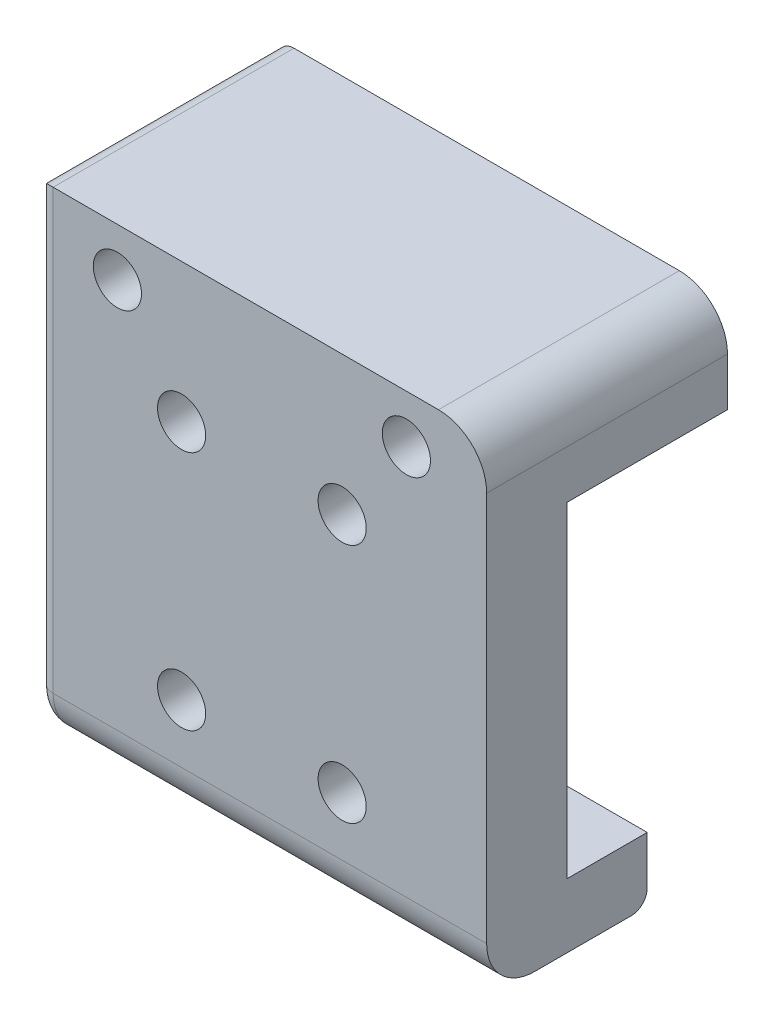
ISO-10303-21;
HEADER;
FILE_DESCRIPTION(('STEP AP214'),'2;1');
FILE_NAME('part.step','',(''),(''),'','','');
FILE_SCHEMA(('AUTOMOTIVE_DESIGN { 1 0 10303 214 1 1 1 1 }'));
ENDSEC;
DATA;
#1=APPLICATION_CONTEXT('core data for automotive mechanical design processes');
#2=APPLICATION_PROTOCOL_DEFINITION('international standard','automotive_design',2000,#1);
#3=PRODUCT_CONTEXT('',#1,'mechanical');
#4=PRODUCT('Part','Part','',(#3));
#5=PRODUCT_RELATED_PRODUCT_CATEGORY('part','',(#4));
#6=PRODUCT_DEFINITION_FORMATION('','',#4);
#7=PRODUCT_DEFINITION_CONTEXT('part definition',#1,'design');
#8=PRODUCT_DEFINITION('design','',#6,#7);
#9=PRODUCT_DEFINITION_SHAPE('','',#8);
#10=(LENGTH_UNIT() NAMED_UNIT(*) SI_UNIT(.MILLI.,.METRE.));
#11=(NAMED_UNIT(*) PLANE_ANGLE_UNIT() SI_UNIT($,.RADIAN.));
#12=(NAMED_UNIT(*) SI_UNIT($,.STERADIAN.) SOLID_ANGLE_UNIT());
#13=UNCERTAINTY_MEASURE_WITH_UNIT(LENGTH_MEASURE(1.E-05),#10,'distance_accuracy_value','');
#14=(GEOMETRIC_REPRESENTATION_CONTEXT(3) GLOBAL_UNCERTAINTY_ASSIGNED_CONTEXT((#13)) GLOBAL_UNIT_ASSIGNED_CONTEXT((#10,
#11,#12)) REPRESENTATION_CONTEXT('',''));
#15=CARTESIAN_POINT('',(0.,0.,0.));
#16=DIRECTION('',(0.,0.,1.));
#17=DIRECTION('',(1.,0.,0.));
#18=AXIS2_PLACEMENT_3D('',#15,#16,#17);
#19=CARTESIAN_POINT('',(0.,0.,5.));
#20=DIRECTION('',(0.,0.,1.));
#21=DIRECTION('',(1.,0.,0.));
#22=AXIS2_PLACEMENT_3D('',#19,#20,#21);
#23=PLANE('',#22);
#24=CARTESIAN_POINT('',(-9.,13.15,5.));
#25=DIRECTION('',(0.,0.,1.));
#26=DIRECTION('',(1.,0.,0.));
#27=AXIS2_PLACEMENT_3D('',#24,#25,#26);
#28=CIRCLE('',#27,1.5);
#29=CARTESIAN_POINT('',(-7.5,13.15,5.));
#30=VERTEX_POINT('',#29);
#31=EDGE_CURVE('E284',#30,#30,#28,.T.);
#32=ORIENTED_EDGE('',*,*,#31,.F.);
#33=EDGE_LOOP('',(#32));
#34=FACE_BOUND('',#33,.T.);
#35=CARTESIAN_POINT('',(9.,13.15,5.));
#36=DIRECTION('',(0.,0.,1.));
#37=DIRECTION('',(1.,0.,0.));
#38=AXIS2_PLACEMENT_3D('',#35,#36,#37);
#39=CIRCLE('',#38,1.5);
#40=CARTESIAN_POINT('',(10.5,13.15,5.));
#41=VERTEX_POINT('',#40);
#42=EDGE_CURVE('E281',#41,#41,#39,.T.);
#43=ORIENTED_EDGE('',*,*,#42,.F.);
#44=EDGE_LOOP('',(#43));
#45=FACE_BOUND('',#44,.T.);
#46=CARTESIAN_POINT('',(5.00000000000001,-7.5,5.));
#47=DIRECTION('',(0.,0.,1.));
#48=DIRECTION('',(1.,0.,0.));
#49=AXIS2_PLACEMENT_3D('',#46,#47,#48);
#50=CIRCLE('',#49,1.5);
#51=CARTESIAN_POINT('',(6.50000000000001,-7.5,5.));
#52=VERTEX_POINT('',#51);
#53=EDGE_CURVE('E197',#52,#52,#50,.T.);
#54=ORIENTED_EDGE('',*,*,#53,.F.);
#55=EDGE_LOOP('',(#54));
#56=FACE_BOUND('',#55,.T.);
#57=CARTESIAN_POINT('',(-5.,7.5,5.));
#58=DIRECTION('',(0.,0.,1.));
#59=DIRECTION('',(1.,0.,0.));
#60=AXIS2_PLACEMENT_3D('',#57,#58,#59);
#61=CIRCLE('',#60,1.5);
#62=CARTESIAN_POINT('',(-3.5,7.5,5.));
#63=VERTEX_POINT('',#62);
#64=EDGE_CURVE('E209',#63,#63,#61,.T.);
#65=ORIENTED_EDGE('',*,*,#64,.F.);
#66=EDGE_LOOP('',(#65));
#67=FACE_BOUND('',#66,.T.);
#68=DIRECTION('',(-1.,0.,0.));
#69=VECTOR('',#68,1.);
#70=CARTESIAN_POINT('',(0.,16.15,5.));
#71=LINE('',#70,#69);
#72=CARTESIAN_POINT('',(11.,16.15,5.));
#73=VERTEX_POINT('',#72);
#74=CARTESIAN_POINT('',(-13.,16.15,5.));
#75=VERTEX_POINT('',#74);
#76=EDGE_CURVE('E183',#73,#75,#71,.T.);
#77=ORIENTED_EDGE('',*,*,#76,.T.);
#78=DIRECTION('',(0.,-1.,0.));
#79=VECTOR('',#78,1.);
#80=CARTESIAN_POINT('',(-13.,-11.15,5.));
#81=LINE('',#80,#79);
#82=CARTESIAN_POINT('',(-13.,-11.15,5.));
#83=VERTEX_POINT('',#82);
#84=EDGE_CURVE('E240',#75,#83,#81,.T.);
#85=ORIENTED_EDGE('',*,*,#84,.T.);
#86=DIRECTION('',(1.,0.,0.));
#87=VECTOR('',#86,1.);
#88=CARTESIAN_POINT('',(0.,-11.15,5.));
#89=LINE('',#88,#87);
#90=CARTESIAN_POINT('',(14.,-11.15,5.));
#91=VERTEX_POINT('',#90);
#92=EDGE_CURVE('E230',#83,#91,#89,.T.);
#93=ORIENTED_EDGE('',*,*,#92,.T.);
#94=DIRECTION('',(0.,1.,0.));
#95=VECTOR('',#94,1.);
#96=CARTESIAN_POINT('',(14.,10.15,5.));
#97=LINE('',#96,#95);
#98=CARTESIAN_POINT('',(14.,13.15,5.));
#99=VERTEX_POINT('',#98);
#100=EDGE_CURVE('E214',#91,#99,#97,.T.);
#101=ORIENTED_EDGE('',*,*,#100,.T.);
#102=CARTESIAN_POINT('',(11.,13.15,5.));
#103=DIRECTION('',(0.,0.,1.));
#104=DIRECTION('',(1.,0.,0.));
#105=AXIS2_PLACEMENT_3D('',#102,#103,#104);
#106=CIRCLE('',#105,3.);
#107=EDGE_CURVE('E232',#99,#73,#106,.T.);
#108=ORIENTED_EDGE('',*,*,#107,.T.);
#109=EDGE_LOOP('',(#77,#85,#93,#101,#108));
#110=FACE_BOUND('',#109,.T.);
#111=CARTESIAN_POINT('',(5.,7.5,5.));
#112=DIRECTION('',(0.,0.,1.));
#113=DIRECTION('',(1.,0.,0.));
#114=AXIS2_PLACEMENT_3D('',#111,#112,#113);
#115=CIRCLE('',#114,1.5);
#116=CARTESIAN_POINT('',(6.5,7.5,5.));
#117=VERTEX_POINT('',#116);
#118=EDGE_CURVE('E203',#117,#117,#115,.T.);
#119=ORIENTED_EDGE('',*,*,#118,.F.);
#120=EDGE_LOOP('',(#119));
#121=FACE_BOUND('',#120,.T.);
#122=CARTESIAN_POINT('',(-5.,-7.5,5.));
#123=DIRECTION('',(0.,0.,1.));
#124=DIRECTION('',(1.,0.,0.));
#125=AXIS2_PLACEMENT_3D('',#122,#123,#124);
#126=CIRCLE('',#125,1.5);
#127=CARTESIAN_POINT('',(-3.5,-7.5,5.));
#128=VERTEX_POINT('',#127);
#129=EDGE_CURVE('E191',#128,#128,#126,.T.);
#130=ORIENTED_EDGE('',*,*,#129,.F.);
#131=EDGE_LOOP('',(#130));
#132=FACE_BOUND('',#131,.T.);
#133=ADVANCED_FACE('F44',(#34,#45,#56,#67,#110,#121,#132),#23,.T.);
#134=CARTESIAN_POINT('',(0.,0.,0.));
#135=DIRECTION('',(0.,0.,1.));
#136=DIRECTION('',(1.,0.,0.));
#137=AXIS2_PLACEMENT_3D('',#134,#135,#136);
#138=PLANE('',#137);
#139=DIRECTION('',(0.,1.,0.));
#140=VECTOR('',#139,1.);
#141=CARTESIAN_POINT('',(14.,10.15,0.));
#142=LINE('',#141,#140);
#143=CARTESIAN_POINT('',(14.,-10.15,0.));
#144=VERTEX_POINT('',#143);
#145=CARTESIAN_POINT('',(14.,10.15,0.));
#146=VERTEX_POINT('',#145);
#147=EDGE_CURVE('E160',#144,#146,#142,.T.);
#148=ORIENTED_EDGE('',*,*,#147,.F.);
#149=DIRECTION('',(1.,0.,0.));
#150=VECTOR('',#149,1.);
#151=CARTESIAN_POINT('',(-14.,-10.15,0.));
#152=LINE('',#151,#150);
#153=CARTESIAN_POINT('',(-14.,-10.15,0.));
#154=VERTEX_POINT('',#153);
#155=EDGE_CURVE('E218',#154,#144,#152,.T.);
#156=ORIENTED_EDGE('',*,*,#155,.F.);
#157=DIRECTION('',(0.,-1.,0.));
#158=VECTOR('',#157,1.);
#159=CARTESIAN_POINT('',(-14.,10.15,0.));
#160=LINE('',#159,#158);
#161=CARTESIAN_POINT('',(-14.,10.15,0.));
#162=VERTEX_POINT('',#161);
#163=EDGE_CURVE('E222',#162,#154,#160,.T.);
#164=ORIENTED_EDGE('',*,*,#163,.F.);
#165=DIRECTION('',(-1.,0.,0.));
#166=VECTOR('',#165,1.);
#167=CARTESIAN_POINT('',(-14.,10.15,0.));
#168=LINE('',#167,#166);
#169=EDGE_CURVE('E220',#146,#162,#168,.T.);
#170=ORIENTED_EDGE('',*,*,#169,.F.);
#171=EDGE_LOOP('',(#148,#156,#164,#170));
#172=FACE_BOUND('',#171,.T.);
#173=CARTESIAN_POINT('',(-5.,7.5,0.));
#174=DIRECTION('',(0.,0.,1.));
#175=DIRECTION('',(1.,0.,0.));
#176=AXIS2_PLACEMENT_3D('',#173,#174,#175);
#177=CIRCLE('',#176,1.5);
#178=CARTESIAN_POINT('',(-3.5,7.5,0.));
#179=VERTEX_POINT('',#178);
#180=EDGE_CURVE('E206',#179,#179,#177,.T.);
#181=ORIENTED_EDGE('',*,*,#180,.T.);
#182=EDGE_LOOP('',(#181));
#183=FACE_BOUND('',#182,.T.);
#184=CARTESIAN_POINT('',(5.,7.5,0.));
#185=DIRECTION('',(0.,0.,1.));
#186=DIRECTION('',(1.,0.,0.));
#187=AXIS2_PLACEMENT_3D('',#184,#185,#186);
#188=CIRCLE('',#187,1.5);
#189=CARTESIAN_POINT('',(6.5,7.5,0.));
#190=VERTEX_POINT('',#189);
#191=EDGE_CURVE('E200',#190,#190,#188,.T.);
#192=ORIENTED_EDGE('',*,*,#191,.T.);
#193=EDGE_LOOP('',(#192));
#194=FACE_BOUND('',#193,.T.);
#195=CARTESIAN_POINT('',(5.00000000000001,-7.5,0.));
#196=DIRECTION('',(0.,0.,1.));
#197=DIRECTION('',(1.,0.,0.));
#198=AXIS2_PLACEMENT_3D('',#195,#196,#197);
#199=CIRCLE('',#198,1.5);
#200=CARTESIAN_POINT('',(6.50000000000001,-7.5,0.));
#201=VERTEX_POINT('',#200);
#202=EDGE_CURVE('E194',#201,#201,#199,.T.);
#203=ORIENTED_EDGE('',*,*,#202,.T.);
#204=EDGE_LOOP('',(#203));
#205=FACE_BOUND('',#204,.T.);
#206=CARTESIAN_POINT('',(-5.,-7.5,0.));
#207=DIRECTION('',(0.,0.,1.));
#208=DIRECTION('',(1.,0.,0.));
#209=AXIS2_PLACEMENT_3D('',#206,#207,#208);
#210=CIRCLE('',#209,1.5);
#211=CARTESIAN_POINT('',(-3.5,-7.5,0.));
#212=VERTEX_POINT('',#211);
#213=EDGE_CURVE('E163',#212,#212,#210,.T.);
#214=ORIENTED_EDGE('',*,*,#213,.T.);
#215=EDGE_LOOP('',(#214));
#216=FACE_BOUND('',#215,.T.);
#217=ADVANCED_FACE('F301',(#172,#183,#194,#205,#216),#138,.F.);
#218=CARTESIAN_POINT('',(14.,10.15,5.));
#219=DIRECTION('',(-1.,0.,0.));
#220=DIRECTION('',(0.,-1.,0.));
#221=AXIS2_PLACEMENT_3D('',#218,#219,#220);
#222=PLANE('',#221);
#223=DIRECTION('',(0.,0.,1.));
#224=VECTOR('',#223,1.);
#225=CARTESIAN_POINT('',(14.,-14.15,-5.));
#226=LINE('',#225,#224);
#227=CARTESIAN_POINT('',(14.,-14.15,-4.));
#228=VERTEX_POINT('',#227);
#229=CARTESIAN_POINT('',(14.,-14.15,2.));
#230=VERTEX_POINT('',#229);
#231=EDGE_CURVE('E181',#228,#230,#226,.T.);
#232=ORIENTED_EDGE('',*,*,#231,.F.);
#233=CARTESIAN_POINT('',(14.,-13.15,-4.));
#234=DIRECTION('',(-1.,0.,0.));
#235=DIRECTION('',(0.,-1.,0.));
#236=AXIS2_PLACEMENT_3D('',#233,#234,#235);
#237=CIRCLE('',#236,1.);
#238=CARTESIAN_POINT('',(14.,-13.15,-5.));
#239=VERTEX_POINT('',#238);
#240=EDGE_CURVE('E53',#228,#239,#237,.F.);
#241=ORIENTED_EDGE('',*,*,#240,.T.);
#242=DIRECTION('',(0.,-1.,0.));
#243=VECTOR('',#242,1.);
#244=CARTESIAN_POINT('',(14.,0.,-5.));
#245=LINE('',#244,#243);
#246=CARTESIAN_POINT('',(14.,-10.15,-5.));
#247=VERTEX_POINT('',#246);
#248=EDGE_CURVE('E170',#247,#239,#245,.T.);
#249=ORIENTED_EDGE('',*,*,#248,.F.);
#250=DIRECTION('',(0.,0.,1.));
#251=VECTOR('',#250,1.);
#252=CARTESIAN_POINT('',(14.,-10.15,-5.));
#253=LINE('',#252,#251);
#254=EDGE_CURVE('E180',#247,#144,#253,.T.);
#255=ORIENTED_EDGE('',*,*,#254,.T.);
#256=ORIENTED_EDGE('',*,*,#147,.T.);
#257=DIRECTION('',(0.,0.,1.));
#258=VECTOR('',#257,1.);
#259=CARTESIAN_POINT('',(14.,10.15,-5.));
#260=LINE('',#259,#258);
#261=CARTESIAN_POINT('',(14.,10.15,-10.));
#262=VERTEX_POINT('',#261);
#263=EDGE_CURVE('E157',#262,#146,#260,.T.);
#264=ORIENTED_EDGE('',*,*,#263,.F.);
#265=DIRECTION('',(0.,-1.,0.));
#266=VECTOR('',#265,1.);
#267=CARTESIAN_POINT('',(14.,16.15,-10.));
#268=LINE('',#267,#266);
#269=CARTESIAN_POINT('',(14.,13.15,-10.));
#270=VERTEX_POINT('',#269);
#271=EDGE_CURVE('E142',#270,#262,#268,.T.);
#272=ORIENTED_EDGE('',*,*,#271,.F.);
#273=DIRECTION('',(0.,0.,1.));
#274=VECTOR('',#273,1.);
#275=CARTESIAN_POINT('',(14.,13.15,5.));
#276=LINE('',#275,#274);
#277=EDGE_CURVE('E228',#270,#99,#276,.T.);
#278=ORIENTED_EDGE('',*,*,#277,.T.);
#279=ORIENTED_EDGE('',*,*,#100,.F.);
#280=CARTESIAN_POINT('',(14.,-11.15,2.));
#281=DIRECTION('',(-1.,0.,0.));
#282=DIRECTION('',(0.,-1.,0.));
#283=AXIS2_PLACEMENT_3D('',#280,#281,#282);
#284=CIRCLE('',#283,3.);
#285=EDGE_CURVE('E217',#91,#230,#284,.F.);
#286=ORIENTED_EDGE('',*,*,#285,.T.);
#287=EDGE_LOOP('',(#232,#241,#249,#255,#256,#264,#272,#278,#279,#286));
#288=FACE_BOUND('',#287,.T.);
#289=ADVANCED_FACE('F158',(#288),#222,.F.);
#290=CARTESIAN_POINT('',(-14.,10.15,5.));
#291=DIRECTION('',(1.,0.,0.));
#292=DIRECTION('',(0.,1.,0.));
#293=AXIS2_PLACEMENT_3D('',#290,#291,#292);
#294=PLANE('',#293);
#295=DIRECTION('',(0.,-1.,0.));
#296=VECTOR('',#295,1.);
#297=CARTESIAN_POINT('',(-14.,16.15,4.));
#298=LINE('',#297,#296);
#299=CARTESIAN_POINT('',(-14.,-11.15,4.));
#300=VERTEX_POINT('',#299);
#301=CARTESIAN_POINT('',(-14.,15.15,4.));
#302=VERTEX_POINT('',#301);
#303=EDGE_CURVE('E247',#300,#302,#298,.F.);
#304=ORIENTED_EDGE('',*,*,#303,.T.);
#305=DIRECTION('',(0.,0.,1.));
#306=VECTOR('',#305,1.);
#307=CARTESIAN_POINT('',(-14.,15.15,-10.));
#308=LINE('',#307,#306);
#309=CARTESIAN_POINT('',(-14.,15.15,-10.));
#310=VERTEX_POINT('',#309);
#311=EDGE_CURVE('E249',#302,#310,#308,.F.);
#312=ORIENTED_EDGE('',*,*,#311,.T.);
#313=DIRECTION('',(0.,1.,0.));
#314=VECTOR('',#313,1.);
#315=CARTESIAN_POINT('',(-14.,10.15,-10.));
#316=LINE('',#315,#314);
#317=CARTESIAN_POINT('',(-14.,10.15,-10.));
#318=VERTEX_POINT('',#317);
#319=EDGE_CURVE('E168',#318,#310,#316,.T.);
#320=ORIENTED_EDGE('',*,*,#319,.F.);
#321=DIRECTION('',(0.,0.,1.));
#322=VECTOR('',#321,1.);
#323=CARTESIAN_POINT('',(-14.,10.15,-5.));
#324=LINE('',#323,#322);
#325=EDGE_CURVE('E164',#318,#162,#324,.T.);
#326=ORIENTED_EDGE('',*,*,#325,.T.);
#327=ORIENTED_EDGE('',*,*,#163,.T.);
#328=DIRECTION('',(0.,0.,1.));
#329=VECTOR('',#328,1.);
#330=CARTESIAN_POINT('',(-14.,-10.15,-5.));
#331=LINE('',#330,#329);
#332=CARTESIAN_POINT('',(-14.,-10.15,-5.));
#333=VERTEX_POINT('',#332);
#334=EDGE_CURVE('E184',#333,#154,#331,.T.);
#335=ORIENTED_EDGE('',*,*,#334,.F.);
#336=DIRECTION('',(0.,-1.,0.));
#337=VECTOR('',#336,1.);
#338=CARTESIAN_POINT('',(-14.,0.,-5.));
#339=LINE('',#338,#337);
#340=CARTESIAN_POINT('',(-14.,-13.15,-5.));
#341=VERTEX_POINT('',#340);
#342=EDGE_CURVE('E177',#333,#341,#339,.T.);
#343=ORIENTED_EDGE('',*,*,#342,.T.);
#344=DIRECTION('',(0.,0.,1.));
#345=VECTOR('',#344,1.);
#346=CARTESIAN_POINT('',(-14.,-13.15,2.));
#347=LINE('',#346,#345);
#348=CARTESIAN_POINT('',(-14.,-13.15,2.));
#349=VERTEX_POINT('',#348);
#350=EDGE_CURVE('E243',#341,#349,#347,.T.);
#351=ORIENTED_EDGE('',*,*,#350,.T.);
#352=CARTESIAN_POINT('',(-14.,-11.15,2.));
#353=DIRECTION('',(1.,0.,0.));
#354=DIRECTION('',(0.,1.,0.));
#355=AXIS2_PLACEMENT_3D('',#352,#353,#354);
#356=CIRCLE('',#355,2.);
#357=EDGE_CURVE('E245',#349,#300,#356,.F.);
#358=ORIENTED_EDGE('',*,*,#357,.T.);
#359=EDGE_LOOP('',(#304,#312,#320,#326,#327,#335,#343,#351,#358));
#360=FACE_BOUND('',#359,.T.);
#361=ADVANCED_FACE('F329',(#360),#294,.F.);
#362=CARTESIAN_POINT('',(-5.,7.5,5.));
#363=DIRECTION('',(0.,0.,-1.));
#364=DIRECTION('',(-1.,0.,0.));
#365=AXIS2_PLACEMENT_3D('',#362,#363,#364);
#366=CYLINDRICAL_SURFACE('',#365,1.5);
#367=ORIENTED_EDGE('',*,*,#64,.T.);
#368=EDGE_LOOP('',(#367));
#369=FACE_BOUND('',#368,.T.);
#370=ORIENTED_EDGE('',*,*,#180,.F.);
#371=EDGE_LOOP('',(#370));
#372=FACE_BOUND('',#371,.T.);
#373=ADVANCED_FACE('F335',(#369,#372),#366,.F.);
#374=CARTESIAN_POINT('',(5.,7.5,5.));
#375=DIRECTION('',(0.,0.,-1.));
#376=DIRECTION('',(-1.,0.,0.));
#377=AXIS2_PLACEMENT_3D('',#374,#375,#376);
#378=CYLINDRICAL_SURFACE('',#377,1.5);
#379=ORIENTED_EDGE('',*,*,#118,.T.);
#380=EDGE_LOOP('',(#379));
#381=FACE_BOUND('',#380,.T.);
#382=ORIENTED_EDGE('',*,*,#191,.F.);
#383=EDGE_LOOP('',(#382));
#384=FACE_BOUND('',#383,.T.);
#385=ADVANCED_FACE('F403',(#381,#384),#378,.F.);
#386=CARTESIAN_POINT('',(5.00000000000001,-7.5,5.));
#387=DIRECTION('',(0.,0.,-1.));
#388=DIRECTION('',(-1.,0.,0.));
#389=AXIS2_PLACEMENT_3D('',#386,#387,#388);
#390=CYLINDRICAL_SURFACE('',#389,1.5);
#391=ORIENTED_EDGE('',*,*,#53,.T.);
#392=EDGE_LOOP('',(#391));
#393=FACE_BOUND('',#392,.T.);
#394=ORIENTED_EDGE('',*,*,#202,.F.);
#395=EDGE_LOOP('',(#394));
#396=FACE_BOUND('',#395,.T.);
#397=ADVANCED_FACE('F319',(#393,#396),#390,.F.);
#398=CARTESIAN_POINT('',(-5.,-7.5,5.));
#399=DIRECTION('',(0.,0.,-1.));
#400=DIRECTION('',(-1.,0.,0.));
#401=AXIS2_PLACEMENT_3D('',#398,#399,#400);
#402=CYLINDRICAL_SURFACE('',#401,1.5);
#403=ORIENTED_EDGE('',*,*,#129,.T.);
#404=EDGE_LOOP('',(#403));
#405=FACE_BOUND('',#404,.T.);
#406=ORIENTED_EDGE('',*,*,#213,.F.);
#407=EDGE_LOOP('',(#406));
#408=FACE_BOUND('',#407,.T.);
#409=ADVANCED_FACE('F316',(#405,#408),#402,.F.);
#410=CARTESIAN_POINT('',(0.,10.15,-5.));
#411=DIRECTION('',(0.,1.,0.));
#412=DIRECTION('',(0.,0.,1.));
#413=AXIS2_PLACEMENT_3D('',#410,#411,#412);
#414=PLANE('',#413);
#415=ORIENTED_EDGE('',*,*,#263,.T.);
#416=ORIENTED_EDGE('',*,*,#169,.T.);
#417=ORIENTED_EDGE('',*,*,#325,.F.);
#418=DIRECTION('',(-1.,0.,0.));
#419=VECTOR('',#418,1.);
#420=CARTESIAN_POINT('',(14.,10.15,-10.));
#421=LINE('',#420,#419);
#422=EDGE_CURVE('E147',#262,#318,#421,.T.);
#423=ORIENTED_EDGE('',*,*,#422,.F.);
#424=EDGE_LOOP('',(#415,#416,#417,#423));
#425=FACE_BOUND('',#424,.T.);
#426=ADVANCED_FACE('F166',(#425),#414,.F.);
#427=CARTESIAN_POINT('',(0.,16.15,-5.));
#428=DIRECTION('',(0.,1.,0.));
#429=DIRECTION('',(-1.,0.,0.));
#430=AXIS2_PLACEMENT_3D('',#427,#428,#429);
#431=PLANE('',#430);
#432=DIRECTION('',(1.,0.,0.));
#433=VECTOR('',#432,1.);
#434=CARTESIAN_POINT('',(-14.,16.15,-10.));
#435=LINE('',#434,#433);
#436=CARTESIAN_POINT('',(-13.,16.15,-10.));
#437=VERTEX_POINT('',#436);
#438=CARTESIAN_POINT('',(11.,16.15,-10.));
#439=VERTEX_POINT('',#438);
#440=EDGE_CURVE('E153',#437,#439,#435,.T.);
#441=ORIENTED_EDGE('',*,*,#440,.F.);
#442=DIRECTION('',(0.,0.,1.));
#443=VECTOR('',#442,1.);
#444=CARTESIAN_POINT('',(-13.,16.15,5.));
#445=LINE('',#444,#443);
#446=EDGE_CURVE('E253',#437,#75,#445,.T.);
#447=ORIENTED_EDGE('',*,*,#446,.T.);
#448=ORIENTED_EDGE('',*,*,#76,.F.);
#449=DIRECTION('',(0.,0.,1.));
#450=VECTOR('',#449,1.);
#451=CARTESIAN_POINT('',(11.,16.15,-10.));
#452=LINE('',#451,#450);
#453=EDGE_CURVE('E234',#73,#439,#452,.F.);
#454=ORIENTED_EDGE('',*,*,#453,.T.);
#455=EDGE_LOOP('',(#441,#447,#448,#454));
#456=FACE_BOUND('',#455,.T.);
#457=ADVANCED_FACE('F378',(#456),#431,.T.);
#458=CARTESIAN_POINT('',(0.,-10.15,-5.));
#459=DIRECTION('',(0.,-1.,0.));
#460=DIRECTION('',(0.,0.,-1.));
#461=AXIS2_PLACEMENT_3D('',#458,#459,#460);
#462=PLANE('',#461);
#463=ORIENTED_EDGE('',*,*,#334,.T.);
#464=ORIENTED_EDGE('',*,*,#155,.T.);
#465=ORIENTED_EDGE('',*,*,#254,.F.);
#466=DIRECTION('',(1.,0.,0.));
#467=VECTOR('',#466,1.);
#468=CARTESIAN_POINT('',(0.,-10.15,-5.));
#469=LINE('',#468,#467);
#470=EDGE_CURVE('E175',#333,#247,#469,.T.);
#471=ORIENTED_EDGE('',*,*,#470,.F.);
#472=EDGE_LOOP('',(#463,#464,#465,#471));
#473=FACE_BOUND('',#472,.T.);
#474=ADVANCED_FACE('F372',(#473),#462,.F.);
#475=CARTESIAN_POINT('',(0.,-14.15,-5.));
#476=DIRECTION('',(0.,-1.,0.));
#477=DIRECTION('',(0.,0.,-1.));
#478=AXIS2_PLACEMENT_3D('',#475,#476,#477);
#479=PLANE('',#478);
#480=DIRECTION('',(1.,0.,0.));
#481=VECTOR('',#480,1.);
#482=CARTESIAN_POINT('',(0.,-14.15,2.));
#483=LINE('',#482,#481);
#484=CARTESIAN_POINT('',(-13.,-14.15,2.));
#485=VERTEX_POINT('',#484);
#486=EDGE_CURVE('E238',#230,#485,#483,.F.);
#487=ORIENTED_EDGE('',*,*,#486,.T.);
#488=DIRECTION('',(0.,0.,1.));
#489=VECTOR('',#488,1.);
#490=CARTESIAN_POINT('',(-13.,-14.15,-5.));
#491=LINE('',#490,#489);
#492=CARTESIAN_POINT('',(-13.,-14.15,-4.));
#493=VERTEX_POINT('',#492);
#494=EDGE_CURVE('E68',#485,#493,#491,.F.);
#495=ORIENTED_EDGE('',*,*,#494,.T.);
#496=DIRECTION('',(1.,0.,0.));
#497=VECTOR('',#496,1.);
#498=CARTESIAN_POINT('',(14.,-14.15,-4.));
#499=LINE('',#498,#497);
#500=EDGE_CURVE('E257',#493,#228,#499,.T.);
#501=ORIENTED_EDGE('',*,*,#500,.T.);
#502=ORIENTED_EDGE('',*,*,#231,.T.);
#503=EDGE_LOOP('',(#487,#495,#501,#502));
#504=FACE_BOUND('',#503,.T.);
#505=ADVANCED_FACE('F384',(#504),#479,.T.);
#506=CARTESIAN_POINT('',(0.,0.,-5.));
#507=DIRECTION('',(0.,0.,1.));
#508=DIRECTION('',(1.,0.,0.));
#509=AXIS2_PLACEMENT_3D('',#506,#507,#508);
#510=PLANE('',#509);
#511=ORIENTED_EDGE('',*,*,#248,.T.);
#512=DIRECTION('',(1.,0.,0.));
#513=VECTOR('',#512,1.);
#514=CARTESIAN_POINT('',(-14.,-13.15,-5.));
#515=LINE('',#514,#513);
#516=EDGE_CURVE('E11',#239,#341,#515,.F.);
#517=ORIENTED_EDGE('',*,*,#516,.T.);
#518=ORIENTED_EDGE('',*,*,#342,.F.);
#519=ORIENTED_EDGE('',*,*,#470,.T.);
#520=EDGE_LOOP('',(#511,#517,#518,#519));
#521=FACE_BOUND('',#520,.T.);
#522=ADVANCED_FACE('F367',(#521),#510,.F.);
#523=CARTESIAN_POINT('',(0.,0.,-10.));
#524=DIRECTION('',(0.,0.,-1.));
#525=DIRECTION('',(-1.,0.,0.));
#526=AXIS2_PLACEMENT_3D('',#523,#524,#525);
#527=PLANE('',#526);
#528=CARTESIAN_POINT('',(-9.,13.15,-10.));
#529=DIRECTION('',(0.,0.,1.));
#530=DIRECTION('',(1.,0.,0.));
#531=AXIS2_PLACEMENT_3D('',#528,#529,#530);
#532=CIRCLE('',#531,1.5);
#533=CARTESIAN_POINT('',(-7.5,13.15,-10.));
#534=VERTEX_POINT('',#533);
#535=EDGE_CURVE('E264',#534,#534,#532,.T.);
#536=ORIENTED_EDGE('',*,*,#535,.T.);
#537=EDGE_LOOP('',(#536));
#538=FACE_BOUND('',#537,.T.);
#539=CARTESIAN_POINT('',(9.,13.15,-10.));
#540=DIRECTION('',(0.,0.,1.));
#541=DIRECTION('',(1.,0.,0.));
#542=AXIS2_PLACEMENT_3D('',#539,#540,#541);
#543=CIRCLE('',#542,1.5);
#544=CARTESIAN_POINT('',(10.5,13.15,-10.));
#545=VERTEX_POINT('',#544);
#546=EDGE_CURVE('E278',#545,#545,#543,.T.);
#547=ORIENTED_EDGE('',*,*,#546,.T.);
#548=EDGE_LOOP('',(#547));
#549=FACE_BOUND('',#548,.T.);
#550=ORIENTED_EDGE('',*,*,#319,.T.);
#551=CARTESIAN_POINT('',(-13.,15.15,-10.));
#552=DIRECTION('',(0.,0.,-1.));
#553=DIRECTION('',(-1.,0.,0.));
#554=AXIS2_PLACEMENT_3D('',#551,#552,#553);
#555=CIRCLE('',#554,1.);
#556=EDGE_CURVE('E255',#310,#437,#555,.T.);
#557=ORIENTED_EDGE('',*,*,#556,.T.);
#558=ORIENTED_EDGE('',*,*,#440,.T.);
#559=CARTESIAN_POINT('',(11.,13.15,-10.));
#560=DIRECTION('',(0.,0.,-1.));
#561=DIRECTION('',(-1.,0.,0.));
#562=AXIS2_PLACEMENT_3D('',#559,#560,#561);
#563=CIRCLE('',#562,3.);
#564=EDGE_CURVE('E150',#439,#270,#563,.T.);
#565=ORIENTED_EDGE('',*,*,#564,.T.);
#566=ORIENTED_EDGE('',*,*,#271,.T.);
#567=ORIENTED_EDGE('',*,*,#422,.T.);
#568=EDGE_LOOP('',(#550,#557,#558,#565,#566,#567));
#569=FACE_BOUND('',#568,.T.);
#570=ADVANCED_FACE('F145',(#538,#549,#569),#527,.T.);
#571=CARTESIAN_POINT('',(11.,13.15,5.));
#572=DIRECTION('',(0.,0.,-1.));
#573=DIRECTION('',(-1.,0.,0.));
#574=AXIS2_PLACEMENT_3D('',#571,#572,#573);
#575=CYLINDRICAL_SURFACE('',#574,3.);
#576=ORIENTED_EDGE('',*,*,#564,.F.);
#577=ORIENTED_EDGE('',*,*,#453,.F.);
#578=ORIENTED_EDGE('',*,*,#107,.F.);
#579=ORIENTED_EDGE('',*,*,#277,.F.);
#580=EDGE_LOOP('',(#576,#577,#578,#579));
#581=FACE_BOUND('',#580,.T.);
#582=ADVANCED_FACE('F338',(#581),#575,.T.);
#583=CARTESIAN_POINT('',(0.,-11.15,2.));
#584=DIRECTION('',(1.,0.,0.));
#585=DIRECTION('',(0.,0.,-1.));
#586=AXIS2_PLACEMENT_3D('',#583,#584,#585);
#587=CYLINDRICAL_SURFACE('',#586,3.);
#588=ORIENTED_EDGE('',*,*,#92,.F.);
#589=CARTESIAN_POINT('',(-13.,-11.15,2.));
#590=DIRECTION('',(1.,0.,0.));
#591=DIRECTION('',(0.,1.,0.));
#592=AXIS2_PLACEMENT_3D('',#589,#590,#591);
#593=CIRCLE('',#592,3.);
#594=EDGE_CURVE('E251',#83,#485,#593,.T.);
#595=ORIENTED_EDGE('',*,*,#594,.T.);
#596=ORIENTED_EDGE('',*,*,#486,.F.);
#597=ORIENTED_EDGE('',*,*,#285,.F.);
#598=EDGE_LOOP('',(#588,#595,#596,#597));
#599=FACE_BOUND('',#598,.T.);
#600=ADVANCED_FACE('F341',(#599),#587,.T.);
#601=CARTESIAN_POINT('',(0.,-13.15,-4.));
#602=DIRECTION('',(-1.,0.,0.));
#603=DIRECTION('',(0.,0.,1.));
#604=AXIS2_PLACEMENT_3D('',#601,#602,#603);
#605=CYLINDRICAL_SURFACE('',#604,1.);
#606=ORIENTED_EDGE('',*,*,#240,.F.);
#607=ORIENTED_EDGE('',*,*,#500,.F.);
#608=CARTESIAN_POINT('',(-13.,-13.15,-4.));
#609=DIRECTION('',(-0.707106781186547,0.,0.707106781186547));
#610=DIRECTION('',(-0.707106781186547,0.,-0.707106781186547));
#611=AXIS2_PLACEMENT_3D('',#608,#609,#610);
#612=ELLIPSE('',#611,1.41421356237309,1.);
#613=EDGE_CURVE('E48',#341,#493,#612,.T.);
#614=ORIENTED_EDGE('',*,*,#613,.F.);
#615=ORIENTED_EDGE('',*,*,#516,.F.);
#616=EDGE_LOOP('',(#606,#607,#614,#615));
#617=FACE_BOUND('',#616,.T.);
#618=ADVANCED_FACE('F46',(#617),#605,.T.);
#619=CARTESIAN_POINT('',(-13.,-13.15,5.));
#620=DIRECTION('',(0.,0.,-1.));
#621=DIRECTION('',(-1.,0.,0.));
#622=AXIS2_PLACEMENT_3D('',#619,#620,#621);
#623=CYLINDRICAL_SURFACE('',#622,1.);
#624=ORIENTED_EDGE('',*,*,#613,.T.);
#625=ORIENTED_EDGE('',*,*,#494,.F.);
#626=CARTESIAN_POINT('',(-13.,-13.15,2.));
#627=DIRECTION('',(0.,0.,1.));
#628=DIRECTION('',(1.,0.,0.));
#629=AXIS2_PLACEMENT_3D('',#626,#627,#628);
#630=CIRCLE('',#629,1.);
#631=EDGE_CURVE('E266',#349,#485,#630,.T.);
#632=ORIENTED_EDGE('',*,*,#631,.F.);
#633=ORIENTED_EDGE('',*,*,#350,.F.);
#634=EDGE_LOOP('',(#624,#625,#632,#633));
#635=FACE_BOUND('',#634,.T.);
#636=ADVANCED_FACE('F355',(#635),#623,.T.);
#637=CARTESIAN_POINT('',(-13.,15.15,-5.));
#638=DIRECTION('',(0.,0.,-1.));
#639=DIRECTION('',(-1.,0.,0.));
#640=AXIS2_PLACEMENT_3D('',#637,#638,#639);
#641=CYLINDRICAL_SURFACE('',#640,1.);
#642=ORIENTED_EDGE('',*,*,#556,.F.);
#643=ORIENTED_EDGE('',*,*,#311,.F.);
#644=CARTESIAN_POINT('',(-13.,15.15,4.));
#645=DIRECTION('',(0.,0.707106781186547,-0.707106781186547));
#646=DIRECTION('',(0.,-0.707106781186547,-0.707106781186547));
#647=AXIS2_PLACEMENT_3D('',#644,#645,#646);
#648=ELLIPSE('',#647,1.41421356237309,1.);
#649=EDGE_CURVE('E263',#75,#302,#648,.F.);
#650=ORIENTED_EDGE('',*,*,#649,.F.);
#651=ORIENTED_EDGE('',*,*,#446,.F.);
#652=EDGE_LOOP('',(#642,#643,#650,#651));
#653=FACE_BOUND('',#652,.T.);
#654=ADVANCED_FACE('F353',(#653),#641,.T.);
#655=CARTESIAN_POINT('',(-13.,-11.15,2.));
#656=DIRECTION('',(1.,0.,0.));
#657=DIRECTION('',(0.,1.,0.));
#658=AXIS2_PLACEMENT_3D('',#655,#656,#657);
#659=TOROIDAL_SURFACE('',#658,2.,1.);
#660=ORIENTED_EDGE('',*,*,#631,.T.);
#661=ORIENTED_EDGE('',*,*,#594,.F.);
#662=CARTESIAN_POINT('',(-13.,-11.15,4.));
#663=DIRECTION('',(0.,1.,0.));
#664=DIRECTION('',(0.,0.,1.));
#665=AXIS2_PLACEMENT_3D('',#662,#663,#664);
#666=CIRCLE('',#665,1.);
#667=EDGE_CURVE('E261',#300,#83,#666,.T.);
#668=ORIENTED_EDGE('',*,*,#667,.F.);
#669=ORIENTED_EDGE('',*,*,#357,.F.);
#670=EDGE_LOOP('',(#660,#661,#668,#669));
#671=FACE_BOUND('',#670,.T.);
#672=ADVANCED_FACE('F349',(#671),#659,.T.);
#673=CARTESIAN_POINT('',(-13.,0.,4.));
#674=DIRECTION('',(0.,1.,0.));
#675=DIRECTION('',(-1.,0.,0.));
#676=AXIS2_PLACEMENT_3D('',#673,#674,#675);
#677=CYLINDRICAL_SURFACE('',#676,1.);
#678=ORIENTED_EDGE('',*,*,#649,.T.);
#679=ORIENTED_EDGE('',*,*,#303,.F.);
#680=ORIENTED_EDGE('',*,*,#667,.T.);
#681=ORIENTED_EDGE('',*,*,#84,.F.);
#682=EDGE_LOOP('',(#678,#679,#680,#681));
#683=FACE_BOUND('',#682,.T.);
#684=ADVANCED_FACE('F346',(#683),#677,.T.);
#685=CARTESIAN_POINT('',(9.,13.15,-10.));
#686=DIRECTION('',(0.,0.,1.));
#687=DIRECTION('',(1.,0.,0.));
#688=AXIS2_PLACEMENT_3D('',#685,#686,#687);
#689=CYLINDRICAL_SURFACE('',#688,1.5);
#690=ORIENTED_EDGE('',*,*,#546,.F.);
#691=EDGE_LOOP('',(#690));
#692=FACE_BOUND('',#691,.T.);
#693=ORIENTED_EDGE('',*,*,#42,.T.);
#694=EDGE_LOOP('',(#693));
#695=FACE_BOUND('',#694,.T.);
#696=ADVANCED_FACE('F295',(#692,#695),#689,.F.);
#697=CARTESIAN_POINT('',(-9.,13.15,-10.));
#698=DIRECTION('',(0.,0.,1.));
#699=DIRECTION('',(1.,0.,0.));
#700=AXIS2_PLACEMENT_3D('',#697,#698,#699);
#701=CYLINDRICAL_SURFACE('',#700,1.5);
#702=ORIENTED_EDGE('',*,*,#535,.F.);
#703=EDGE_LOOP('',(#702));
#704=FACE_BOUND('',#703,.T.);
#705=ORIENTED_EDGE('',*,*,#31,.T.);
#706=EDGE_LOOP('',(#705));
#707=FACE_BOUND('',#706,.T.);
#708=ADVANCED_FACE('F292',(#704,#707),#701,.F.);
#709=CLOSED_SHELL('',(#133,#217,#289,#361,#373,#385,#397,#409,#426,#457,#474,#505,#522,#570,
#582,#600,#618,#636,#654,#672,#684,#696,#708));
#710=MANIFOLD_SOLID_BREP('B2',#709);
#711=ADVANCED_BREP_SHAPE_REPRESENTATION('',(#18,#710),#14);
#712=SHAPE_DEFINITION_REPRESENTATION(#9,#711);
ENDSEC;
END-ISO-10303-21;
